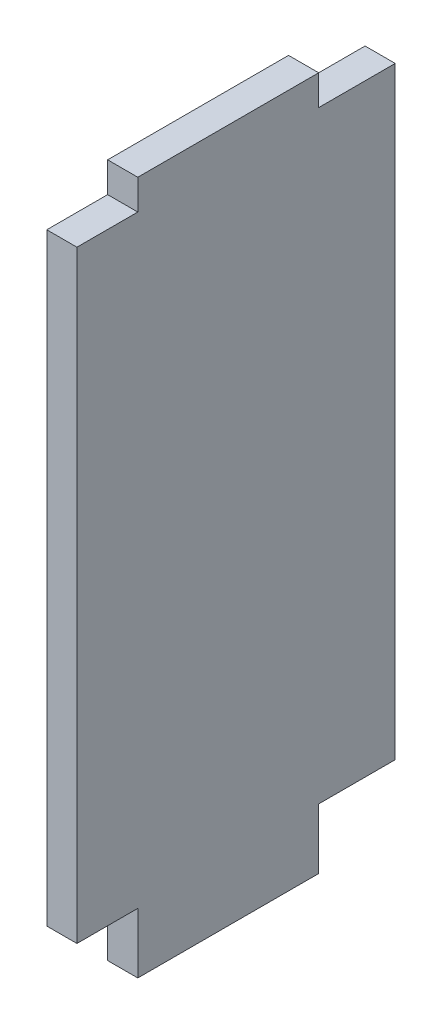
ISO-10303-21;
HEADER;
FILE_DESCRIPTION(('STEP AP214'),'2;1');
FILE_NAME('part.step','',(''),(''),'','','');
FILE_SCHEMA(('AUTOMOTIVE_DESIGN { 1 0 10303 214 1 1 1 1 }'));
ENDSEC;
DATA;
#1=APPLICATION_CONTEXT('core data for automotive mechanical design processes');
#2=APPLICATION_PROTOCOL_DEFINITION('international standard','automotive_design',2000,#1);
#3=PRODUCT_CONTEXT('',#1,'mechanical');
#4=PRODUCT('Part','Part','',(#3));
#5=PRODUCT_RELATED_PRODUCT_CATEGORY('part','',(#4));
#6=PRODUCT_DEFINITION_FORMATION('','',#4);
#7=PRODUCT_DEFINITION_CONTEXT('part definition',#1,'design');
#8=PRODUCT_DEFINITION('design','',#6,#7);
#9=PRODUCT_DEFINITION_SHAPE('','',#8);
#10=(LENGTH_UNIT() NAMED_UNIT(*) SI_UNIT(.MILLI.,.METRE.));
#11=(NAMED_UNIT(*) PLANE_ANGLE_UNIT() SI_UNIT($,.RADIAN.));
#12=(NAMED_UNIT(*) SI_UNIT($,.STERADIAN.) SOLID_ANGLE_UNIT());
#13=UNCERTAINTY_MEASURE_WITH_UNIT(LENGTH_MEASURE(1.E-05),#10,'distance_accuracy_value','');
#14=(GEOMETRIC_REPRESENTATION_CONTEXT(3) GLOBAL_UNCERTAINTY_ASSIGNED_CONTEXT((#13)) GLOBAL_UNIT_ASSIGNED_CONTEXT((#10,
#11,#12)) REPRESENTATION_CONTEXT('',''));
#15=CARTESIAN_POINT('',(0.,0.,0.));
#16=DIRECTION('',(0.,0.,1.));
#17=DIRECTION('',(1.,0.,0.));
#18=AXIS2_PLACEMENT_3D('',#15,#16,#17);
#19=CARTESIAN_POINT('',(1.25,25.,-6.85046433));
#20=DIRECTION('',(0.,-1.,0.));
#21=DIRECTION('',(0.,0.,-1.));
#22=AXIS2_PLACEMENT_3D('',#19,#20,#21);
#23=PLANE('',#22);
#24=DIRECTION('',(0.,0.,1.));
#25=VECTOR('',#24,1.);
#26=CARTESIAN_POINT('',(-1.25,25.,-6.85046433));
#27=LINE('',#26,#25);
#28=CARTESIAN_POINT('',(-1.25,25.,-13.195));
#29=VERTEX_POINT('',#28);
#30=CARTESIAN_POINT('',(-1.25,25.,-6.85046433));
#31=VERTEX_POINT('',#30);
#32=EDGE_CURVE('E164',#29,#31,#27,.T.);
#33=ORIENTED_EDGE('',*,*,#32,.T.);
#34=DIRECTION('',(-1.,0.,0.));
#35=VECTOR('',#34,1.);
#36=CARTESIAN_POINT('',(1.25,25.,-6.85046433));
#37=LINE('',#36,#35);
#38=CARTESIAN_POINT('',(1.25,25.,-6.85046433));
#39=VERTEX_POINT('',#38);
#40=EDGE_CURVE('E11',#39,#31,#37,.T.);
#41=ORIENTED_EDGE('',*,*,#40,.F.);
#42=DIRECTION('',(0.,0.,1.));
#43=VECTOR('',#42,1.);
#44=CARTESIAN_POINT('',(1.25,25.,-6.85046433));
#45=LINE('',#44,#43);
#46=CARTESIAN_POINT('',(1.25,25.,-13.195));
#47=VERTEX_POINT('',#46);
#48=EDGE_CURVE('E198',#47,#39,#45,.T.);
#49=ORIENTED_EDGE('',*,*,#48,.F.);
#50=DIRECTION('',(-1.,0.,0.));
#51=VECTOR('',#50,1.);
#52=CARTESIAN_POINT('',(1.25,25.,-13.195));
#53=LINE('',#52,#51);
#54=EDGE_CURVE('E160',#47,#29,#53,.T.);
#55=ORIENTED_EDGE('',*,*,#54,.T.);
#56=EDGE_LOOP('',(#33,#41,#49,#55));
#57=FACE_BOUND('',#56,.T.);
#58=ADVANCED_FACE('F39',(#57),#23,.F.);
#59=CARTESIAN_POINT('',(1.25,27.5,-6.85046433));
#60=DIRECTION('',(0.,0.,1.));
#61=DIRECTION('',(1.,0.,0.));
#62=AXIS2_PLACEMENT_3D('',#59,#60,#61);
#63=PLANE('',#62);
#64=DIRECTION('',(0.,1.,0.));
#65=VECTOR('',#64,1.);
#66=CARTESIAN_POINT('',(-1.25,27.5,-6.85046433));
#67=LINE('',#66,#65);
#68=CARTESIAN_POINT('',(-1.25,27.5,-6.85046433));
#69=VERTEX_POINT('',#68);
#70=EDGE_CURVE('E168',#31,#69,#67,.T.);
#71=ORIENTED_EDGE('',*,*,#70,.T.);
#72=DIRECTION('',(-1.,0.,0.));
#73=VECTOR('',#72,1.);
#74=CARTESIAN_POINT('',(1.25,27.5,-6.85046433));
#75=LINE('',#74,#73);
#76=CARTESIAN_POINT('',(1.25,27.5,-6.85046433));
#77=VERTEX_POINT('',#76);
#78=EDGE_CURVE('E48',#77,#69,#75,.T.);
#79=ORIENTED_EDGE('',*,*,#78,.F.);
#80=DIRECTION('',(0.,1.,0.));
#81=VECTOR('',#80,1.);
#82=CARTESIAN_POINT('',(1.25,27.5,-6.85046433));
#83=LINE('',#82,#81);
#84=EDGE_CURVE('E111',#39,#77,#83,.T.);
#85=ORIENTED_EDGE('',*,*,#84,.F.);
#86=ORIENTED_EDGE('',*,*,#40,.T.);
#87=EDGE_LOOP('',(#71,#79,#85,#86));
#88=FACE_BOUND('',#87,.T.);
#89=ADVANCED_FACE('F292',(#88),#63,.F.);
#90=CARTESIAN_POINT('',(1.25,27.5,8.14953567));
#91=DIRECTION('',(0.,-1.,0.));
#92=DIRECTION('',(0.,0.,-1.));
#93=AXIS2_PLACEMENT_3D('',#90,#91,#92);
#94=PLANE('',#93);
#95=DIRECTION('',(0.,0.,1.));
#96=VECTOR('',#95,1.);
#97=CARTESIAN_POINT('',(-1.25,27.5,8.14953567));
#98=LINE('',#97,#96);
#99=CARTESIAN_POINT('',(-1.25,27.5,8.14953567));
#100=VERTEX_POINT('',#99);
#101=EDGE_CURVE('E171',#69,#100,#98,.T.);
#102=ORIENTED_EDGE('',*,*,#101,.T.);
#103=DIRECTION('',(-1.,0.,0.));
#104=VECTOR('',#103,1.);
#105=CARTESIAN_POINT('',(1.25,27.5,8.14953567));
#106=LINE('',#105,#104);
#107=CARTESIAN_POINT('',(1.25,27.5,8.14953567));
#108=VERTEX_POINT('',#107);
#109=EDGE_CURVE('E225',#108,#100,#106,.T.);
#110=ORIENTED_EDGE('',*,*,#109,.F.);
#111=DIRECTION('',(0.,0.,1.));
#112=VECTOR('',#111,1.);
#113=CARTESIAN_POINT('',(1.25,27.5,8.14953567));
#114=LINE('',#113,#112);
#115=EDGE_CURVE('E235',#77,#108,#114,.T.);
#116=ORIENTED_EDGE('',*,*,#115,.F.);
#117=ORIENTED_EDGE('',*,*,#78,.T.);
#118=EDGE_LOOP('',(#102,#110,#116,#117));
#119=FACE_BOUND('',#118,.T.);
#120=ADVANCED_FACE('F233',(#119),#94,.F.);
#121=CARTESIAN_POINT('',(1.25,25.,8.14953567));
#122=DIRECTION('',(0.,0.,-1.));
#123=DIRECTION('',(-1.,0.,0.));
#124=AXIS2_PLACEMENT_3D('',#121,#122,#123);
#125=PLANE('',#124);
#126=DIRECTION('',(0.,-1.,0.));
#127=VECTOR('',#126,1.);
#128=CARTESIAN_POINT('',(-1.25,25.,8.14953567));
#129=LINE('',#128,#127);
#130=CARTESIAN_POINT('',(-1.25,25.,8.14953567));
#131=VERTEX_POINT('',#130);
#132=EDGE_CURVE('E174',#100,#131,#129,.T.);
#133=ORIENTED_EDGE('',*,*,#132,.T.);
#134=DIRECTION('',(-1.,0.,0.));
#135=VECTOR('',#134,1.);
#136=CARTESIAN_POINT('',(1.25,25.,8.14953567));
#137=LINE('',#136,#135);
#138=CARTESIAN_POINT('',(1.25,25.,8.14953567));
#139=VERTEX_POINT('',#138);
#140=EDGE_CURVE('E221',#139,#131,#137,.T.);
#141=ORIENTED_EDGE('',*,*,#140,.F.);
#142=DIRECTION('',(0.,-1.,0.));
#143=VECTOR('',#142,1.);
#144=CARTESIAN_POINT('',(1.25,25.,8.14953567));
#145=LINE('',#144,#143);
#146=EDGE_CURVE('E254',#108,#139,#145,.T.);
#147=ORIENTED_EDGE('',*,*,#146,.F.);
#148=ORIENTED_EDGE('',*,*,#109,.T.);
#149=EDGE_LOOP('',(#133,#141,#147,#148));
#150=FACE_BOUND('',#149,.T.);
#151=ADVANCED_FACE('F244',(#150),#125,.F.);
#152=CARTESIAN_POINT('',(1.25,25.,13.195));
#153=DIRECTION('',(0.,-1.,0.));
#154=DIRECTION('',(0.,0.,-1.));
#155=AXIS2_PLACEMENT_3D('',#152,#153,#154);
#156=PLANE('',#155);
#157=DIRECTION('',(0.,0.,1.));
#158=VECTOR('',#157,1.);
#159=CARTESIAN_POINT('',(-1.25,25.,13.195));
#160=LINE('',#159,#158);
#161=CARTESIAN_POINT('',(-1.25,25.,13.195));
#162=VERTEX_POINT('',#161);
#163=EDGE_CURVE('E177',#131,#162,#160,.T.);
#164=ORIENTED_EDGE('',*,*,#163,.T.);
#165=DIRECTION('',(-1.,0.,0.));
#166=VECTOR('',#165,1.);
#167=CARTESIAN_POINT('',(1.25,25.,13.195));
#168=LINE('',#167,#166);
#169=CARTESIAN_POINT('',(1.25,25.,13.195));
#170=VERTEX_POINT('',#169);
#171=EDGE_CURVE('E217',#170,#162,#168,.T.);
#172=ORIENTED_EDGE('',*,*,#171,.F.);
#173=DIRECTION('',(0.,0.,1.));
#174=VECTOR('',#173,1.);
#175=CARTESIAN_POINT('',(1.25,25.,13.195));
#176=LINE('',#175,#174);
#177=EDGE_CURVE('E250',#139,#170,#176,.T.);
#178=ORIENTED_EDGE('',*,*,#177,.F.);
#179=ORIENTED_EDGE('',*,*,#140,.T.);
#180=EDGE_LOOP('',(#164,#172,#178,#179));
#181=FACE_BOUND('',#180,.T.);
#182=ADVANCED_FACE('F248',(#181),#156,.F.);
#183=CARTESIAN_POINT('',(1.25,-25.,13.195));
#184=DIRECTION('',(0.,0.,-1.));
#185=DIRECTION('',(-1.,0.,0.));
#186=AXIS2_PLACEMENT_3D('',#183,#184,#185);
#187=PLANE('',#186);
#188=DIRECTION('',(0.,-1.,0.));
#189=VECTOR('',#188,1.);
#190=CARTESIAN_POINT('',(-1.25,-25.,13.195));
#191=LINE('',#190,#189);
#192=CARTESIAN_POINT('',(-1.25,-25.,13.195));
#193=VERTEX_POINT('',#192);
#194=EDGE_CURVE('E180',#162,#193,#191,.T.);
#195=ORIENTED_EDGE('',*,*,#194,.T.);
#196=DIRECTION('',(-1.,0.,0.));
#197=VECTOR('',#196,1.);
#198=CARTESIAN_POINT('',(1.25,-25.,13.195));
#199=LINE('',#198,#197);
#200=CARTESIAN_POINT('',(1.25,-25.,13.195));
#201=VERTEX_POINT('',#200);
#202=EDGE_CURVE('E213',#201,#193,#199,.T.);
#203=ORIENTED_EDGE('',*,*,#202,.F.);
#204=DIRECTION('',(0.,-1.,0.));
#205=VECTOR('',#204,1.);
#206=CARTESIAN_POINT('',(1.25,-25.,13.195));
#207=LINE('',#206,#205);
#208=EDGE_CURVE('E253',#170,#201,#207,.T.);
#209=ORIENTED_EDGE('',*,*,#208,.F.);
#210=ORIENTED_EDGE('',*,*,#171,.T.);
#211=EDGE_LOOP('',(#195,#203,#209,#210));
#212=FACE_BOUND('',#211,.T.);
#213=ADVANCED_FACE('F305',(#212),#187,.F.);
#214=CARTESIAN_POINT('',(1.25,-25.,13.195));
#215=DIRECTION('',(0.,1.,0.));
#216=DIRECTION('',(0.,0.,1.));
#217=AXIS2_PLACEMENT_3D('',#214,#215,#216);
#218=PLANE('',#217);
#219=DIRECTION('',(0.,0.,-1.));
#220=VECTOR('',#219,1.);
#221=CARTESIAN_POINT('',(-1.25,-25.,13.195));
#222=LINE('',#221,#220);
#223=CARTESIAN_POINT('',(-1.25,-25.,8.14953567));
#224=VERTEX_POINT('',#223);
#225=EDGE_CURVE('E183',#193,#224,#222,.T.);
#226=ORIENTED_EDGE('',*,*,#225,.T.);
#227=DIRECTION('',(-1.,0.,0.));
#228=VECTOR('',#227,1.);
#229=CARTESIAN_POINT('',(1.25,-25.,8.14953567));
#230=LINE('',#229,#228);
#231=CARTESIAN_POINT('',(1.25,-25.,8.14953567));
#232=VERTEX_POINT('',#231);
#233=EDGE_CURVE('E209',#232,#224,#230,.T.);
#234=ORIENTED_EDGE('',*,*,#233,.F.);
#235=DIRECTION('',(0.,0.,-1.));
#236=VECTOR('',#235,1.);
#237=CARTESIAN_POINT('',(1.25,-25.,13.195));
#238=LINE('',#237,#236);
#239=EDGE_CURVE('E258',#201,#232,#238,.T.);
#240=ORIENTED_EDGE('',*,*,#239,.F.);
#241=ORIENTED_EDGE('',*,*,#202,.T.);
#242=EDGE_LOOP('',(#226,#234,#240,#241));
#243=FACE_BOUND('',#242,.T.);
#244=ADVANCED_FACE('F308',(#243),#218,.F.);
#245=CARTESIAN_POINT('',(1.25,-25.,8.14953567));
#246=DIRECTION('',(0.,0.,-1.));
#247=DIRECTION('',(-1.,0.,0.));
#248=AXIS2_PLACEMENT_3D('',#245,#246,#247);
#249=PLANE('',#248);
#250=DIRECTION('',(0.,-1.,0.));
#251=VECTOR('',#250,1.);
#252=CARTESIAN_POINT('',(-1.25,-25.,8.14953567));
#253=LINE('',#252,#251);
#254=CARTESIAN_POINT('',(-1.25,-30.,8.14953567));
#255=VERTEX_POINT('',#254);
#256=EDGE_CURVE('E186',#224,#255,#253,.T.);
#257=ORIENTED_EDGE('',*,*,#256,.T.);
#258=DIRECTION('',(-1.,0.,0.));
#259=VECTOR('',#258,1.);
#260=CARTESIAN_POINT('',(1.25,-30.,8.14953567));
#261=LINE('',#260,#259);
#262=CARTESIAN_POINT('',(1.25,-30.,8.14953567));
#263=VERTEX_POINT('',#262);
#264=EDGE_CURVE('E205',#263,#255,#261,.T.);
#265=ORIENTED_EDGE('',*,*,#264,.F.);
#266=DIRECTION('',(0.,-1.,0.));
#267=VECTOR('',#266,1.);
#268=CARTESIAN_POINT('',(1.25,-25.,8.14953567));
#269=LINE('',#268,#267);
#270=EDGE_CURVE('E265',#232,#263,#269,.T.);
#271=ORIENTED_EDGE('',*,*,#270,.F.);
#272=ORIENTED_EDGE('',*,*,#233,.T.);
#273=EDGE_LOOP('',(#257,#265,#271,#272));
#274=FACE_BOUND('',#273,.T.);
#275=ADVANCED_FACE('F273',(#274),#249,.F.);
#276=CARTESIAN_POINT('',(1.25,-30.,8.14953567));
#277=DIRECTION('',(0.,1.,0.));
#278=DIRECTION('',(0.,0.,1.));
#279=AXIS2_PLACEMENT_3D('',#276,#277,#278);
#280=PLANE('',#279);
#281=DIRECTION('',(0.,0.,-1.));
#282=VECTOR('',#281,1.);
#283=CARTESIAN_POINT('',(-1.25,-30.,8.14953567));
#284=LINE('',#283,#282);
#285=CARTESIAN_POINT('',(-1.25,-30.,-6.85046433));
#286=VERTEX_POINT('',#285);
#287=EDGE_CURVE('E189',#255,#286,#284,.T.);
#288=ORIENTED_EDGE('',*,*,#287,.T.);
#289=DIRECTION('',(-1.,0.,0.));
#290=VECTOR('',#289,1.);
#291=CARTESIAN_POINT('',(1.25,-30.,-6.85046433));
#292=LINE('',#291,#290);
#293=CARTESIAN_POINT('',(1.25,-30.,-6.85046433));
#294=VERTEX_POINT('',#293);
#295=EDGE_CURVE('E153',#294,#286,#292,.T.);
#296=ORIENTED_EDGE('',*,*,#295,.F.);
#297=DIRECTION('',(0.,0.,-1.));
#298=VECTOR('',#297,1.);
#299=CARTESIAN_POINT('',(1.25,-30.,8.14953567));
#300=LINE('',#299,#298);
#301=EDGE_CURVE('E142',#263,#294,#300,.T.);
#302=ORIENTED_EDGE('',*,*,#301,.F.);
#303=ORIENTED_EDGE('',*,*,#264,.T.);
#304=EDGE_LOOP('',(#288,#296,#302,#303));
#305=FACE_BOUND('',#304,.T.);
#306=ADVANCED_FACE('F277',(#305),#280,.F.);
#307=CARTESIAN_POINT('',(1.25,-30.,-6.85046433));
#308=DIRECTION('',(0.,0.,1.));
#309=DIRECTION('',(0.,-1.,0.));
#310=AXIS2_PLACEMENT_3D('',#307,#308,#309);
#311=PLANE('',#310);
#312=DIRECTION('',(0.,1.,0.));
#313=VECTOR('',#312,1.);
#314=CARTESIAN_POINT('',(-1.25,-30.,-6.85046433));
#315=LINE('',#314,#313);
#316=CARTESIAN_POINT('',(-1.25,-25.,-6.85046433));
#317=VERTEX_POINT('',#316);
#318=EDGE_CURVE('E151',#286,#317,#315,.T.);
#319=ORIENTED_EDGE('',*,*,#318,.T.);
#320=DIRECTION('',(-1.,0.,0.));
#321=VECTOR('',#320,1.);
#322=CARTESIAN_POINT('',(1.25,-25.,-6.85046433));
#323=LINE('',#322,#321);
#324=CARTESIAN_POINT('',(1.25,-25.,-6.85046433));
#325=VERTEX_POINT('',#324);
#326=EDGE_CURVE('E148',#325,#317,#323,.T.);
#327=ORIENTED_EDGE('',*,*,#326,.F.);
#328=DIRECTION('',(0.,1.,0.));
#329=VECTOR('',#328,1.);
#330=CARTESIAN_POINT('',(1.25,-30.,-6.85046433));
#331=LINE('',#330,#329);
#332=EDGE_CURVE('E136',#294,#325,#331,.T.);
#333=ORIENTED_EDGE('',*,*,#332,.F.);
#334=ORIENTED_EDGE('',*,*,#295,.T.);
#335=EDGE_LOOP('',(#319,#327,#333,#334));
#336=FACE_BOUND('',#335,.T.);
#337=ADVANCED_FACE('F149',(#336),#311,.F.);
#338=CARTESIAN_POINT('',(1.25,-25.,-6.85046433));
#339=DIRECTION('',(0.,1.,0.));
#340=DIRECTION('',(0.,0.,1.));
#341=AXIS2_PLACEMENT_3D('',#338,#339,#340);
#342=PLANE('',#341);
#343=DIRECTION('',(0.,0.,-1.));
#344=VECTOR('',#343,1.);
#345=CARTESIAN_POINT('',(-1.25,-25.,-6.85046433));
#346=LINE('',#345,#344);
#347=CARTESIAN_POINT('',(-1.25,-25.,-13.195));
#348=VERTEX_POINT('',#347);
#349=EDGE_CURVE('E97',#317,#348,#346,.T.);
#350=ORIENTED_EDGE('',*,*,#349,.T.);
#351=DIRECTION('',(-1.,0.,0.));
#352=VECTOR('',#351,1.);
#353=CARTESIAN_POINT('',(1.25,-25.,-13.195));
#354=LINE('',#353,#352);
#355=CARTESIAN_POINT('',(1.25,-25.,-13.195));
#356=VERTEX_POINT('',#355);
#357=EDGE_CURVE('E154',#356,#348,#354,.T.);
#358=ORIENTED_EDGE('',*,*,#357,.F.);
#359=DIRECTION('',(0.,0.,-1.));
#360=VECTOR('',#359,1.);
#361=CARTESIAN_POINT('',(1.25,-25.,-6.85046433));
#362=LINE('',#361,#360);
#363=EDGE_CURVE('E140',#325,#356,#362,.T.);
#364=ORIENTED_EDGE('',*,*,#363,.F.);
#365=ORIENTED_EDGE('',*,*,#326,.T.);
#366=EDGE_LOOP('',(#350,#358,#364,#365));
#367=FACE_BOUND('',#366,.T.);
#368=ADVANCED_FACE('F156',(#367),#342,.F.);
#369=CARTESIAN_POINT('',(1.25,-25.,-13.195));
#370=DIRECTION('',(0.,0.,1.));
#371=DIRECTION('',(1.,0.,0.));
#372=AXIS2_PLACEMENT_3D('',#369,#370,#371);
#373=PLANE('',#372);
#374=DIRECTION('',(0.,1.,0.));
#375=VECTOR('',#374,1.);
#376=CARTESIAN_POINT('',(-1.25,-25.,-13.195));
#377=LINE('',#376,#375);
#378=EDGE_CURVE('E103',#348,#29,#377,.T.);
#379=ORIENTED_EDGE('',*,*,#378,.T.);
#380=ORIENTED_EDGE('',*,*,#54,.F.);
#381=DIRECTION('',(0.,1.,0.));
#382=VECTOR('',#381,1.);
#383=CARTESIAN_POINT('',(1.25,-25.,-13.195));
#384=LINE('',#383,#382);
#385=EDGE_CURVE('E56',#356,#47,#384,.T.);
#386=ORIENTED_EDGE('',*,*,#385,.F.);
#387=ORIENTED_EDGE('',*,*,#357,.T.);
#388=EDGE_LOOP('',(#379,#380,#386,#387));
#389=FACE_BOUND('',#388,.T.);
#390=ADVANCED_FACE('F281',(#389),#373,.F.);
#391=CARTESIAN_POINT('',(1.25,0.,0.));
#392=DIRECTION('',(1.,0.,0.));
#393=DIRECTION('',(0.,0.,-1.));
#394=AXIS2_PLACEMENT_3D('',#391,#392,#393);
#395=PLANE('',#394);
#396=ORIENTED_EDGE('',*,*,#48,.T.);
#397=ORIENTED_EDGE('',*,*,#84,.T.);
#398=ORIENTED_EDGE('',*,*,#115,.T.);
#399=ORIENTED_EDGE('',*,*,#146,.T.);
#400=ORIENTED_EDGE('',*,*,#177,.T.);
#401=ORIENTED_EDGE('',*,*,#208,.T.);
#402=ORIENTED_EDGE('',*,*,#239,.T.);
#403=ORIENTED_EDGE('',*,*,#270,.T.);
#404=ORIENTED_EDGE('',*,*,#301,.T.);
#405=ORIENTED_EDGE('',*,*,#332,.T.);
#406=ORIENTED_EDGE('',*,*,#363,.T.);
#407=ORIENTED_EDGE('',*,*,#385,.T.);
#408=EDGE_LOOP('',(#396,#397,#398,#399,#400,#401,#402,#403,#404,#405,#406,#407));
#409=FACE_BOUND('',#408,.T.);
#410=ADVANCED_FACE('F138',(#409),#395,.T.);
#411=CARTESIAN_POINT('',(-1.25,0.,0.));
#412=DIRECTION('',(1.,0.,0.));
#413=DIRECTION('',(0.,0.,-1.));
#414=AXIS2_PLACEMENT_3D('',#411,#412,#413);
#415=PLANE('',#414);
#416=ORIENTED_EDGE('',*,*,#32,.F.);
#417=ORIENTED_EDGE('',*,*,#378,.F.);
#418=ORIENTED_EDGE('',*,*,#349,.F.);
#419=ORIENTED_EDGE('',*,*,#318,.F.);
#420=ORIENTED_EDGE('',*,*,#287,.F.);
#421=ORIENTED_EDGE('',*,*,#256,.F.);
#422=ORIENTED_EDGE('',*,*,#225,.F.);
#423=ORIENTED_EDGE('',*,*,#194,.F.);
#424=ORIENTED_EDGE('',*,*,#163,.F.);
#425=ORIENTED_EDGE('',*,*,#132,.F.);
#426=ORIENTED_EDGE('',*,*,#101,.F.);
#427=ORIENTED_EDGE('',*,*,#70,.F.);
#428=EDGE_LOOP('',(#416,#417,#418,#419,#420,#421,#422,#423,#424,#425,#426,#427));
#429=FACE_BOUND('',#428,.T.);
#430=ADVANCED_FACE('F239',(#429),#415,.F.);
#431=CLOSED_SHELL('',(#58,#89,#120,#151,#182,#213,#244,#275,#306,#337,#368,#390,#410,#430));
#432=MANIFOLD_SOLID_BREP('B2',#431);
#433=ADVANCED_BREP_SHAPE_REPRESENTATION('',(#18,#432),#14);
#434=SHAPE_DEFINITION_REPRESENTATION(#9,#433);
ENDSEC;
END-ISO-10303-21;
